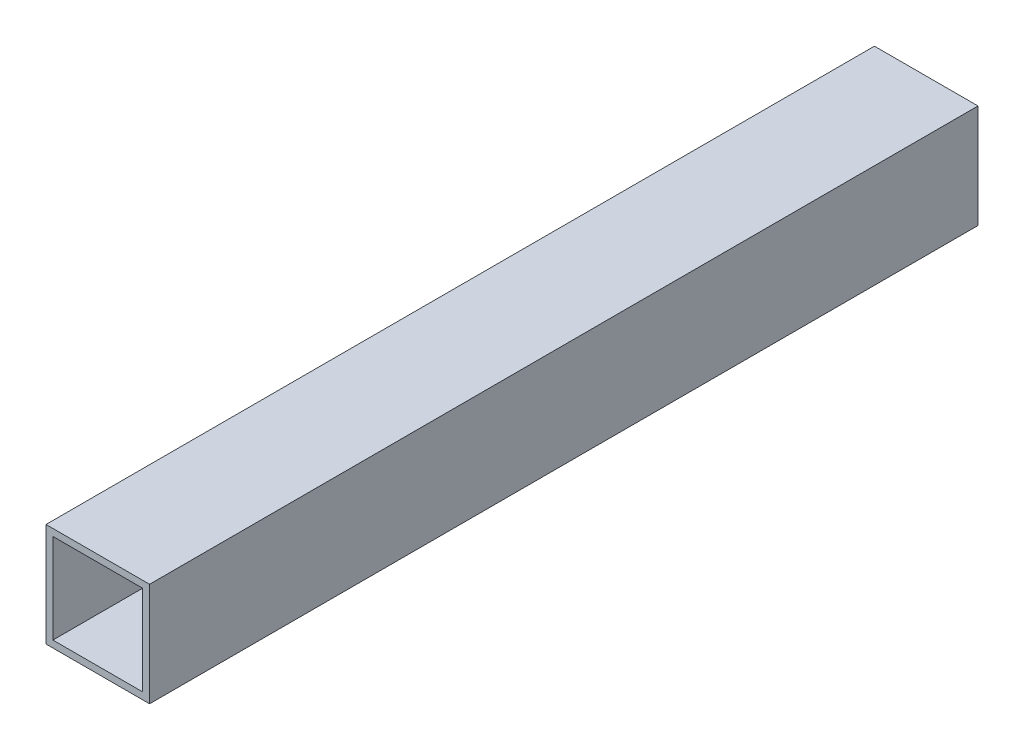
ISO-10303-21;
HEADER;
FILE_DESCRIPTION(('STEP AP214'),'2;1');
FILE_NAME('part.step','',(''),(''),'','','');
FILE_SCHEMA(('AUTOMOTIVE_DESIGN { 1 0 10303 214 1 1 1 1 }'));
ENDSEC;
DATA;
#1=APPLICATION_CONTEXT('core data for automotive mechanical design processes');
#2=APPLICATION_PROTOCOL_DEFINITION('international standard','automotive_design',2000,#1);
#3=PRODUCT_CONTEXT('',#1,'mechanical');
#4=PRODUCT('Part','Part','',(#3));
#5=PRODUCT_RELATED_PRODUCT_CATEGORY('part','',(#4));
#6=PRODUCT_DEFINITION_FORMATION('','',#4);
#7=PRODUCT_DEFINITION_CONTEXT('part definition',#1,'design');
#8=PRODUCT_DEFINITION('design','',#6,#7);
#9=PRODUCT_DEFINITION_SHAPE('','',#8);
#10=(LENGTH_UNIT() NAMED_UNIT(*) SI_UNIT(.MILLI.,.METRE.));
#11=(NAMED_UNIT(*) PLANE_ANGLE_UNIT() SI_UNIT($,.RADIAN.));
#12=(NAMED_UNIT(*) SI_UNIT($,.STERADIAN.) SOLID_ANGLE_UNIT());
#13=UNCERTAINTY_MEASURE_WITH_UNIT(LENGTH_MEASURE(1.E-05),#10,'distance_accuracy_value','');
#14=(GEOMETRIC_REPRESENTATION_CONTEXT(3) GLOBAL_UNCERTAINTY_ASSIGNED_CONTEXT((#13)) GLOBAL_UNIT_ASSIGNED_CONTEXT((#10,
#11,#12)) REPRESENTATION_CONTEXT('',''));
#15=CARTESIAN_POINT('',(0.,0.,0.));
#16=DIRECTION('',(0.,0.,1.));
#17=DIRECTION('',(1.,0.,0.));
#18=AXIS2_PLACEMENT_3D('',#15,#16,#17);
#19=CARTESIAN_POINT('',(0.,0.,240.));
#20=DIRECTION('',(0.,0.,-1.));
#21=DIRECTION('',(-1.,0.,0.));
#22=AXIS2_PLACEMENT_3D('',#19,#20,#21);
#23=PLANE('',#22);
#24=DIRECTION('',(0.,1.,0.));
#25=VECTOR('',#24,1.);
#26=CARTESIAN_POINT('',(15.,-15.,240.));
#27=LINE('',#26,#25);
#28=CARTESIAN_POINT('',(15.,-15.,240.));
#29=VERTEX_POINT('',#28);
#30=CARTESIAN_POINT('',(15.,15.,240.));
#31=VERTEX_POINT('',#30);
#32=EDGE_CURVE('E134',#29,#31,#27,.T.);
#33=ORIENTED_EDGE('',*,*,#32,.T.);
#34=DIRECTION('',(-1.,0.,0.));
#35=VECTOR('',#34,1.);
#36=CARTESIAN_POINT('',(-15.,15.,240.));
#37=LINE('',#36,#35);
#38=CARTESIAN_POINT('',(-15.,15.,240.));
#39=VERTEX_POINT('',#38);
#40=EDGE_CURVE('E137',#31,#39,#37,.T.);
#41=ORIENTED_EDGE('',*,*,#40,.T.);
#42=DIRECTION('',(0.,-1.,0.));
#43=VECTOR('',#42,1.);
#44=CARTESIAN_POINT('',(-15.,-15.,240.));
#45=LINE('',#44,#43);
#46=CARTESIAN_POINT('',(-15.,-15.,240.));
#47=VERTEX_POINT('',#46);
#48=EDGE_CURVE('E140',#39,#47,#45,.T.);
#49=ORIENTED_EDGE('',*,*,#48,.T.);
#50=DIRECTION('',(1.,0.,0.));
#51=VECTOR('',#50,1.);
#52=CARTESIAN_POINT('',(-15.,-15.,240.));
#53=LINE('',#52,#51);
#54=EDGE_CURVE('E142',#47,#29,#53,.T.);
#55=ORIENTED_EDGE('',*,*,#54,.T.);
#56=EDGE_LOOP('',(#33,#41,#49,#55));
#57=FACE_BOUND('',#56,.T.);
#58=DIRECTION('',(0.,-1.,0.));
#59=VECTOR('',#58,1.);
#60=CARTESIAN_POINT('',(-13.,-13.,240.));
#61=LINE('',#60,#59);
#62=CARTESIAN_POINT('',(-13.,13.,240.));
#63=VERTEX_POINT('',#62);
#64=CARTESIAN_POINT('',(-13.,-13.,240.));
#65=VERTEX_POINT('',#64);
#66=EDGE_CURVE('E98',#63,#65,#61,.T.);
#67=ORIENTED_EDGE('',*,*,#66,.F.);
#68=DIRECTION('',(-1.,0.,0.));
#69=VECTOR('',#68,1.);
#70=CARTESIAN_POINT('',(-13.,13.,240.));
#71=LINE('',#70,#69);
#72=CARTESIAN_POINT('',(13.,13.,240.));
#73=VERTEX_POINT('',#72);
#74=EDGE_CURVE('E120',#73,#63,#71,.T.);
#75=ORIENTED_EDGE('',*,*,#74,.F.);
#76=DIRECTION('',(0.,1.,0.));
#77=VECTOR('',#76,1.);
#78=CARTESIAN_POINT('',(13.,-13.,240.));
#79=LINE('',#78,#77);
#80=CARTESIAN_POINT('',(13.,-13.,240.));
#81=VERTEX_POINT('',#80);
#82=EDGE_CURVE('E118',#81,#73,#79,.T.);
#83=ORIENTED_EDGE('',*,*,#82,.F.);
#84=DIRECTION('',(1.,0.,0.));
#85=VECTOR('',#84,1.);
#86=CARTESIAN_POINT('',(-13.,-13.,240.));
#87=LINE('',#86,#85);
#88=EDGE_CURVE('E106',#65,#81,#87,.T.);
#89=ORIENTED_EDGE('',*,*,#88,.F.);
#90=EDGE_LOOP('',(#67,#75,#83,#89));
#91=FACE_BOUND('',#90,.T.);
#92=ADVANCED_FACE('F33',(#57,#91),#23,.F.);
#93=CARTESIAN_POINT('',(0.,0.,0.));
#94=DIRECTION('',(0.,0.,-1.));
#95=DIRECTION('',(-1.,0.,0.));
#96=AXIS2_PLACEMENT_3D('',#93,#94,#95);
#97=PLANE('',#96);
#98=DIRECTION('',(0.,1.,0.));
#99=VECTOR('',#98,1.);
#100=CARTESIAN_POINT('',(15.,-15.,0.));
#101=LINE('',#100,#99);
#102=CARTESIAN_POINT('',(15.,-15.,0.));
#103=VERTEX_POINT('',#102);
#104=CARTESIAN_POINT('',(15.,15.,0.));
#105=VERTEX_POINT('',#104);
#106=EDGE_CURVE('E114',#103,#105,#101,.T.);
#107=ORIENTED_EDGE('',*,*,#106,.F.);
#108=DIRECTION('',(1.,0.,0.));
#109=VECTOR('',#108,1.);
#110=CARTESIAN_POINT('',(-15.,-15.,0.));
#111=LINE('',#110,#109);
#112=CARTESIAN_POINT('',(-15.,-15.,0.));
#113=VERTEX_POINT('',#112);
#114=EDGE_CURVE('E138',#113,#103,#111,.T.);
#115=ORIENTED_EDGE('',*,*,#114,.F.);
#116=DIRECTION('',(0.,-1.,0.));
#117=VECTOR('',#116,1.);
#118=CARTESIAN_POINT('',(-15.,-15.,0.));
#119=LINE('',#118,#117);
#120=CARTESIAN_POINT('',(-15.,15.,0.));
#121=VERTEX_POINT('',#120);
#122=EDGE_CURVE('E149',#121,#113,#119,.T.);
#123=ORIENTED_EDGE('',*,*,#122,.F.);
#124=DIRECTION('',(-1.,0.,0.));
#125=VECTOR('',#124,1.);
#126=CARTESIAN_POINT('',(-15.,15.,0.));
#127=LINE('',#126,#125);
#128=EDGE_CURVE('E147',#105,#121,#127,.T.);
#129=ORIENTED_EDGE('',*,*,#128,.F.);
#130=EDGE_LOOP('',(#107,#115,#123,#129));
#131=FACE_BOUND('',#130,.T.);
#132=DIRECTION('',(-1.,0.,0.));
#133=VECTOR('',#132,1.);
#134=CARTESIAN_POINT('',(-13.,13.,0.));
#135=LINE('',#134,#133);
#136=CARTESIAN_POINT('',(13.,13.,0.));
#137=VERTEX_POINT('',#136);
#138=CARTESIAN_POINT('',(-13.,13.,0.));
#139=VERTEX_POINT('',#138);
#140=EDGE_CURVE('E107',#137,#139,#135,.T.);
#141=ORIENTED_EDGE('',*,*,#140,.T.);
#142=DIRECTION('',(0.,-1.,0.));
#143=VECTOR('',#142,1.);
#144=CARTESIAN_POINT('',(-13.,-13.,0.));
#145=LINE('',#144,#143);
#146=CARTESIAN_POINT('',(-13.,-13.,0.));
#147=VERTEX_POINT('',#146);
#148=EDGE_CURVE('E56',#139,#147,#145,.T.);
#149=ORIENTED_EDGE('',*,*,#148,.T.);
#150=DIRECTION('',(1.,0.,0.));
#151=VECTOR('',#150,1.);
#152=CARTESIAN_POINT('',(-13.,-13.,0.));
#153=LINE('',#152,#151);
#154=CARTESIAN_POINT('',(13.,-13.,0.));
#155=VERTEX_POINT('',#154);
#156=EDGE_CURVE('E113',#147,#155,#153,.T.);
#157=ORIENTED_EDGE('',*,*,#156,.T.);
#158=DIRECTION('',(0.,1.,0.));
#159=VECTOR('',#158,1.);
#160=CARTESIAN_POINT('',(13.,-13.,0.));
#161=LINE('',#160,#159);
#162=EDGE_CURVE('E126',#155,#137,#161,.T.);
#163=ORIENTED_EDGE('',*,*,#162,.T.);
#164=EDGE_LOOP('',(#141,#149,#157,#163));
#165=FACE_BOUND('',#164,.T.);
#166=ADVANCED_FACE('F167',(#131,#165),#97,.T.);
#167=CARTESIAN_POINT('',(15.,-15.,240.));
#168=DIRECTION('',(-1.,0.,0.));
#169=DIRECTION('',(0.,0.,1.));
#170=AXIS2_PLACEMENT_3D('',#167,#168,#169);
#171=PLANE('',#170);
#172=ORIENTED_EDGE('',*,*,#106,.T.);
#173=DIRECTION('',(0.,0.,-1.));
#174=VECTOR('',#173,1.);
#175=CARTESIAN_POINT('',(15.,15.,240.));
#176=LINE('',#175,#174);
#177=EDGE_CURVE('E11',#31,#105,#176,.T.);
#178=ORIENTED_EDGE('',*,*,#177,.F.);
#179=ORIENTED_EDGE('',*,*,#32,.F.);
#180=DIRECTION('',(0.,0.,-1.));
#181=VECTOR('',#180,1.);
#182=CARTESIAN_POINT('',(15.,-15.,240.));
#183=LINE('',#182,#181);
#184=EDGE_CURVE('E144',#29,#103,#183,.T.);
#185=ORIENTED_EDGE('',*,*,#184,.T.);
#186=EDGE_LOOP('',(#172,#178,#179,#185));
#187=FACE_BOUND('',#186,.T.);
#188=ADVANCED_FACE('F35',(#187),#171,.F.);
#189=CARTESIAN_POINT('',(-15.,15.,240.));
#190=DIRECTION('',(0.,-1.,0.));
#191=DIRECTION('',(0.,0.,-1.));
#192=AXIS2_PLACEMENT_3D('',#189,#190,#191);
#193=PLANE('',#192);
#194=ORIENTED_EDGE('',*,*,#128,.T.);
#195=DIRECTION('',(0.,0.,-1.));
#196=VECTOR('',#195,1.);
#197=CARTESIAN_POINT('',(-15.,15.,240.));
#198=LINE('',#197,#196);
#199=EDGE_CURVE('E41',#39,#121,#198,.T.);
#200=ORIENTED_EDGE('',*,*,#199,.F.);
#201=ORIENTED_EDGE('',*,*,#40,.F.);
#202=ORIENTED_EDGE('',*,*,#177,.T.);
#203=EDGE_LOOP('',(#194,#200,#201,#202));
#204=FACE_BOUND('',#203,.T.);
#205=ADVANCED_FACE('F177',(#204),#193,.F.);
#206=CARTESIAN_POINT('',(-15.,-15.,240.));
#207=DIRECTION('',(1.,0.,0.));
#208=DIRECTION('',(0.,0.,-1.));
#209=AXIS2_PLACEMENT_3D('',#206,#207,#208);
#210=PLANE('',#209);
#211=ORIENTED_EDGE('',*,*,#122,.T.);
#212=DIRECTION('',(0.,0.,-1.));
#213=VECTOR('',#212,1.);
#214=CARTESIAN_POINT('',(-15.,-15.,240.));
#215=LINE('',#214,#213);
#216=EDGE_CURVE('E154',#47,#113,#215,.T.);
#217=ORIENTED_EDGE('',*,*,#216,.F.);
#218=ORIENTED_EDGE('',*,*,#48,.F.);
#219=ORIENTED_EDGE('',*,*,#199,.T.);
#220=EDGE_LOOP('',(#211,#217,#218,#219));
#221=FACE_BOUND('',#220,.T.);
#222=ADVANCED_FACE('F161',(#221),#210,.F.);
#223=CARTESIAN_POINT('',(-15.,-15.,240.));
#224=DIRECTION('',(0.,1.,0.));
#225=DIRECTION('',(0.,0.,1.));
#226=AXIS2_PLACEMENT_3D('',#223,#224,#225);
#227=PLANE('',#226);
#228=ORIENTED_EDGE('',*,*,#114,.T.);
#229=ORIENTED_EDGE('',*,*,#184,.F.);
#230=ORIENTED_EDGE('',*,*,#54,.F.);
#231=ORIENTED_EDGE('',*,*,#216,.T.);
#232=EDGE_LOOP('',(#228,#229,#230,#231));
#233=FACE_BOUND('',#232,.T.);
#234=ADVANCED_FACE('F171',(#233),#227,.F.);
#235=CARTESIAN_POINT('',(-13.,-13.,240.));
#236=DIRECTION('',(1.,0.,0.));
#237=DIRECTION('',(0.,0.,-1.));
#238=AXIS2_PLACEMENT_3D('',#235,#236,#237);
#239=PLANE('',#238);
#240=ORIENTED_EDGE('',*,*,#148,.F.);
#241=DIRECTION('',(0.,0.,-1.));
#242=VECTOR('',#241,1.);
#243=CARTESIAN_POINT('',(-13.,13.,240.));
#244=LINE('',#243,#242);
#245=EDGE_CURVE('E102',#63,#139,#244,.T.);
#246=ORIENTED_EDGE('',*,*,#245,.F.);
#247=ORIENTED_EDGE('',*,*,#66,.T.);
#248=DIRECTION('',(0.,0.,-1.));
#249=VECTOR('',#248,1.);
#250=CARTESIAN_POINT('',(-13.,-13.,240.));
#251=LINE('',#250,#249);
#252=EDGE_CURVE('E101',#65,#147,#251,.T.);
#253=ORIENTED_EDGE('',*,*,#252,.T.);
#254=EDGE_LOOP('',(#240,#246,#247,#253));
#255=FACE_BOUND('',#254,.T.);
#256=ADVANCED_FACE('F100',(#255),#239,.T.);
#257=CARTESIAN_POINT('',(-13.,-13.,240.));
#258=DIRECTION('',(0.,1.,0.));
#259=DIRECTION('',(0.,0.,1.));
#260=AXIS2_PLACEMENT_3D('',#257,#258,#259);
#261=PLANE('',#260);
#262=ORIENTED_EDGE('',*,*,#156,.F.);
#263=ORIENTED_EDGE('',*,*,#252,.F.);
#264=ORIENTED_EDGE('',*,*,#88,.T.);
#265=DIRECTION('',(0.,0.,-1.));
#266=VECTOR('',#265,1.);
#267=CARTESIAN_POINT('',(13.,-13.,240.));
#268=LINE('',#267,#266);
#269=EDGE_CURVE('E115',#81,#155,#268,.T.);
#270=ORIENTED_EDGE('',*,*,#269,.T.);
#271=EDGE_LOOP('',(#262,#263,#264,#270));
#272=FACE_BOUND('',#271,.T.);
#273=ADVANCED_FACE('F110',(#272),#261,.T.);
#274=CARTESIAN_POINT('',(13.,-13.,240.));
#275=DIRECTION('',(-1.,0.,0.));
#276=DIRECTION('',(0.,-1.,0.));
#277=AXIS2_PLACEMENT_3D('',#274,#275,#276);
#278=PLANE('',#277);
#279=ORIENTED_EDGE('',*,*,#162,.F.);
#280=ORIENTED_EDGE('',*,*,#269,.F.);
#281=ORIENTED_EDGE('',*,*,#82,.T.);
#282=DIRECTION('',(0.,0.,-1.));
#283=VECTOR('',#282,1.);
#284=CARTESIAN_POINT('',(13.,13.,240.));
#285=LINE('',#284,#283);
#286=EDGE_CURVE('E48',#73,#137,#285,.T.);
#287=ORIENTED_EDGE('',*,*,#286,.T.);
#288=EDGE_LOOP('',(#279,#280,#281,#287));
#289=FACE_BOUND('',#288,.T.);
#290=ADVANCED_FACE('F200',(#289),#278,.T.);
#291=CARTESIAN_POINT('',(-13.,13.,240.));
#292=DIRECTION('',(0.,-1.,0.));
#293=DIRECTION('',(1.,0.,0.));
#294=AXIS2_PLACEMENT_3D('',#291,#292,#293);
#295=PLANE('',#294);
#296=ORIENTED_EDGE('',*,*,#140,.F.);
#297=ORIENTED_EDGE('',*,*,#286,.F.);
#298=ORIENTED_EDGE('',*,*,#74,.T.);
#299=ORIENTED_EDGE('',*,*,#245,.T.);
#300=EDGE_LOOP('',(#296,#297,#298,#299));
#301=FACE_BOUND('',#300,.T.);
#302=ADVANCED_FACE('F204',(#301),#295,.T.);
#303=CLOSED_SHELL('',(#92,#166,#188,#205,#222,#234,#256,#273,#290,#302));
#304=MANIFOLD_SOLID_BREP('B2',#303);
#305=ADVANCED_BREP_SHAPE_REPRESENTATION('',(#18,#304),#14);
#306=SHAPE_DEFINITION_REPRESENTATION(#9,#305);
ENDSEC;
END-ISO-10303-21;
